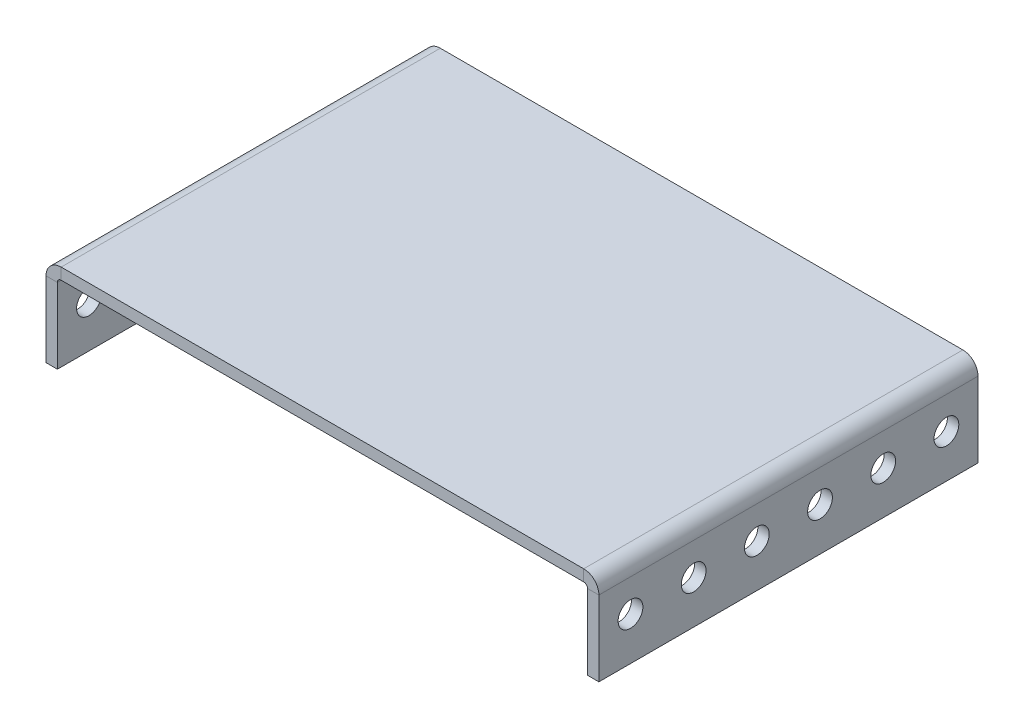
ISO-10303-21;
HEADER;
FILE_DESCRIPTION(('STEP AP214'),'2;1');
FILE_NAME('part.step','',(''),(''),'','','');
FILE_SCHEMA(('AUTOMOTIVE_DESIGN { 1 0 10303 214 1 1 1 1 }'));
ENDSEC;
DATA;
#1=APPLICATION_CONTEXT('core data for automotive mechanical design processes');
#2=APPLICATION_PROTOCOL_DEFINITION('international standard','automotive_design',2000,#1);
#3=PRODUCT_CONTEXT('',#1,'mechanical');
#4=PRODUCT('Part','Part','',(#3));
#5=PRODUCT_RELATED_PRODUCT_CATEGORY('part','',(#4));
#6=PRODUCT_DEFINITION_FORMATION('','',#4);
#7=PRODUCT_DEFINITION_CONTEXT('part definition',#1,'design');
#8=PRODUCT_DEFINITION('design','',#6,#7);
#9=PRODUCT_DEFINITION_SHAPE('','',#8);
#10=(LENGTH_UNIT() NAMED_UNIT(*) SI_UNIT(.MILLI.,.METRE.));
#11=(NAMED_UNIT(*) PLANE_ANGLE_UNIT() SI_UNIT($,.RADIAN.));
#12=(NAMED_UNIT(*) SI_UNIT($,.STERADIAN.) SOLID_ANGLE_UNIT());
#13=UNCERTAINTY_MEASURE_WITH_UNIT(LENGTH_MEASURE(1.E-05),#10,'distance_accuracy_value','');
#14=(GEOMETRIC_REPRESENTATION_CONTEXT(3) GLOBAL_UNCERTAINTY_ASSIGNED_CONTEXT((#13)) GLOBAL_UNIT_ASSIGNED_CONTEXT((#10,
#11,#12)) REPRESENTATION_CONTEXT('',''));
#15=CARTESIAN_POINT('',(0.,0.,0.));
#16=DIRECTION('',(0.,0.,1.));
#17=DIRECTION('',(1.,0.,0.));
#18=AXIS2_PLACEMENT_3D('',#15,#16,#17);
#19=CARTESIAN_POINT('',(52.5145,7.93749999999999,76.2));
#20=DIRECTION('',(0.,0.,1.));
#21=DIRECTION('',(1.,0.,0.));
#22=AXIS2_PLACEMENT_3D('',#19,#20,#21);
#23=PLANE('',#22);
#24=DIRECTION('',(0.,1.,0.));
#25=VECTOR('',#24,1.);
#26=CARTESIAN_POINT('',(52.5145,7.93749999999999,76.2));
#27=LINE('',#26,#25);
#28=CARTESIAN_POINT('',(52.5145,7.93749999999999,76.2));
#29=VERTEX_POINT('',#28);
#30=CARTESIAN_POINT('',(52.5145,10.2235,76.2));
#31=VERTEX_POINT('',#30);
#32=EDGE_CURVE('E11',#29,#31,#27,.T.);
#33=ORIENTED_EDGE('',*,*,#32,.F.);
#34=CARTESIAN_POINT('',(52.5145,7.17549999999999,76.2));
#35=DIRECTION('',(0.,0.,-1.));
#36=DIRECTION('',(-1.,0.,0.));
#37=AXIS2_PLACEMENT_3D('',#34,#35,#36);
#38=CIRCLE('',#37,0.762);
#39=CARTESIAN_POINT('',(53.2765,7.17549999999999,76.2));
#40=VERTEX_POINT('',#39);
#41=EDGE_CURVE('E252',#40,#29,#38,.F.);
#42=ORIENTED_EDGE('',*,*,#41,.F.);
#43=DIRECTION('',(-1.,0.,0.));
#44=VECTOR('',#43,1.);
#45=CARTESIAN_POINT('',(55.5625,7.17549999999999,76.2));
#46=LINE('',#45,#44);
#47=CARTESIAN_POINT('',(55.5625,7.17549999999999,76.2));
#48=VERTEX_POINT('',#47);
#49=EDGE_CURVE('E49',#48,#40,#46,.T.);
#50=ORIENTED_EDGE('',*,*,#49,.F.);
#51=CARTESIAN_POINT('',(52.5145,7.17549999999999,76.2));
#52=DIRECTION('',(0.,0.,1.));
#53=DIRECTION('',(1.,0.,0.));
#54=AXIS2_PLACEMENT_3D('',#51,#52,#53);
#55=CIRCLE('',#54,3.048);
#56=EDGE_CURVE('E150',#48,#31,#55,.T.);
#57=ORIENTED_EDGE('',*,*,#56,.T.);
#58=EDGE_LOOP('',(#33,#42,#50,#57));
#59=FACE_BOUND('',#58,.T.);
#60=ADVANCED_FACE('F41',(#59),#23,.T.);
#61=CARTESIAN_POINT('',(55.5625,7.17549999999999,76.2));
#62=DIRECTION('',(0.,0.,1.));
#63=DIRECTION('',(1.,0.,0.));
#64=AXIS2_PLACEMENT_3D('',#61,#62,#63);
#65=PLANE('',#64);
#66=DIRECTION('',(-1.,0.,0.));
#67=VECTOR('',#66,1.);
#68=CARTESIAN_POINT('',(-53.2765,7.9375,76.2));
#69=LINE('',#68,#67);
#70=CARTESIAN_POINT('',(-52.5145,7.9375,76.2));
#71=VERTEX_POINT('',#70);
#72=EDGE_CURVE('E144',#29,#71,#69,.T.);
#73=ORIENTED_EDGE('',*,*,#72,.F.);
#74=ORIENTED_EDGE('',*,*,#32,.T.);
#75=DIRECTION('',(-1.,0.,0.));
#76=VECTOR('',#75,1.);
#77=CARTESIAN_POINT('',(-53.2765,10.2235,76.2));
#78=LINE('',#77,#76);
#79=CARTESIAN_POINT('',(-52.5145,10.2235,76.2));
#80=VERTEX_POINT('',#79);
#81=EDGE_CURVE('E141',#31,#80,#78,.T.);
#82=ORIENTED_EDGE('',*,*,#81,.T.);
#83=DIRECTION('',(0.,-1.,0.));
#84=VECTOR('',#83,1.);
#85=CARTESIAN_POINT('',(-52.5145,10.2235,76.2));
#86=LINE('',#85,#84);
#87=EDGE_CURVE('E233',#80,#71,#86,.T.);
#88=ORIENTED_EDGE('',*,*,#87,.T.);
#89=EDGE_LOOP('',(#73,#74,#82,#88));
#90=FACE_BOUND('',#89,.T.);
#91=ADVANCED_FACE('F139',(#90),#65,.T.);
#92=CARTESIAN_POINT('',(53.2765,7.17549999999999,0.));
#93=DIRECTION('',(0.,0.,-1.));
#94=DIRECTION('',(-1.,0.,0.));
#95=AXIS2_PLACEMENT_3D('',#92,#93,#94);
#96=PLANE('',#95);
#97=DIRECTION('',(1.,0.,0.));
#98=VECTOR('',#97,1.);
#99=CARTESIAN_POINT('',(53.2765,7.17549999999999,0.));
#100=LINE('',#99,#98);
#101=CARTESIAN_POINT('',(53.2765,7.17549999999999,0.));
#102=VERTEX_POINT('',#101);
#103=CARTESIAN_POINT('',(55.5625,7.17549999999999,0.));
#104=VERTEX_POINT('',#103);
#105=EDGE_CURVE('E238',#102,#104,#100,.T.);
#106=ORIENTED_EDGE('',*,*,#105,.F.);
#107=CARTESIAN_POINT('',(52.5145,7.17549999999999,0.));
#108=DIRECTION('',(0.,0.,-1.));
#109=DIRECTION('',(-1.,0.,0.));
#110=AXIS2_PLACEMENT_3D('',#107,#108,#109);
#111=CIRCLE('',#110,0.762);
#112=CARTESIAN_POINT('',(52.5145,7.93749999999999,0.));
#113=VERTEX_POINT('',#112);
#114=EDGE_CURVE('E190',#102,#113,#111,.F.);
#115=ORIENTED_EDGE('',*,*,#114,.T.);
#116=DIRECTION('',(0.,-1.,0.));
#117=VECTOR('',#116,1.);
#118=CARTESIAN_POINT('',(52.5145,10.2235,0.));
#119=LINE('',#118,#117);
#120=CARTESIAN_POINT('',(52.5145,10.2235,0.));
#121=VERTEX_POINT('',#120);
#122=EDGE_CURVE('E236',#121,#113,#119,.T.);
#123=ORIENTED_EDGE('',*,*,#122,.F.);
#124=CARTESIAN_POINT('',(52.5145,7.17549999999999,0.));
#125=DIRECTION('',(0.,0.,1.));
#126=DIRECTION('',(1.,0.,0.));
#127=AXIS2_PLACEMENT_3D('',#124,#125,#126);
#128=CIRCLE('',#127,3.048);
#129=EDGE_CURVE('E162',#104,#121,#128,.T.);
#130=ORIENTED_EDGE('',*,*,#129,.F.);
#131=EDGE_LOOP('',(#106,#115,#123,#130));
#132=FACE_BOUND('',#131,.T.);
#133=ADVANCED_FACE('F365',(#132),#96,.T.);
#134=CARTESIAN_POINT('',(52.5145,10.2235,0.));
#135=DIRECTION('',(0.,0.,-1.));
#136=DIRECTION('',(-1.,0.,0.));
#137=AXIS2_PLACEMENT_3D('',#134,#135,#136);
#138=PLANE('',#137);
#139=DIRECTION('',(0.,1.,0.));
#140=VECTOR('',#139,1.);
#141=CARTESIAN_POINT('',(53.2765,7.93749999999999,0.));
#142=LINE('',#141,#140);
#143=CARTESIAN_POINT('',(53.2765,-7.93749999999999,0.));
#144=VERTEX_POINT('',#143);
#145=EDGE_CURVE('E193',#144,#102,#142,.T.);
#146=ORIENTED_EDGE('',*,*,#145,.T.);
#147=ORIENTED_EDGE('',*,*,#105,.T.);
#148=DIRECTION('',(0.,1.,0.));
#149=VECTOR('',#148,1.);
#150=CARTESIAN_POINT('',(55.5625,7.93749999999999,0.));
#151=LINE('',#150,#149);
#152=CARTESIAN_POINT('',(55.5625,-7.93749999999999,0.));
#153=VERTEX_POINT('',#152);
#154=EDGE_CURVE('E199',#153,#104,#151,.T.);
#155=ORIENTED_EDGE('',*,*,#154,.F.);
#156=DIRECTION('',(-1.,0.,0.));
#157=VECTOR('',#156,1.);
#158=CARTESIAN_POINT('',(55.5625,-7.93749999999999,0.));
#159=LINE('',#158,#157);
#160=EDGE_CURVE('E196',#153,#144,#159,.T.);
#161=ORIENTED_EDGE('',*,*,#160,.T.);
#162=EDGE_LOOP('',(#146,#147,#155,#161));
#163=FACE_BOUND('',#162,.T.);
#164=ADVANCED_FACE('F410',(#163),#138,.T.);
#165=CARTESIAN_POINT('',(-53.2765,7.1755,76.2));
#166=DIRECTION('',(0.,0.,1.));
#167=DIRECTION('',(1.,0.,0.));
#168=AXIS2_PLACEMENT_3D('',#165,#166,#167);
#169=PLANE('',#168);
#170=DIRECTION('',(-1.,0.,0.));
#171=VECTOR('',#170,1.);
#172=CARTESIAN_POINT('',(-53.2765,7.1755,76.2));
#173=LINE('',#172,#171);
#174=CARTESIAN_POINT('',(-53.2765,7.1755,76.2));
#175=VERTEX_POINT('',#174);
#176=CARTESIAN_POINT('',(-55.5625,7.1755,76.2));
#177=VERTEX_POINT('',#176);
#178=EDGE_CURVE('E57',#175,#177,#173,.T.);
#179=ORIENTED_EDGE('',*,*,#178,.F.);
#180=CARTESIAN_POINT('',(-52.5145,7.1755,76.2));
#181=DIRECTION('',(0.,0.,-1.));
#182=DIRECTION('',(-1.,0.,0.));
#183=AXIS2_PLACEMENT_3D('',#180,#181,#182);
#184=CIRCLE('',#183,0.762);
#185=EDGE_CURVE('E262',#71,#175,#184,.F.);
#186=ORIENTED_EDGE('',*,*,#185,.F.);
#187=ORIENTED_EDGE('',*,*,#87,.F.);
#188=CARTESIAN_POINT('',(-52.5145,7.1755,76.2));
#189=DIRECTION('',(0.,0.,1.));
#190=DIRECTION('',(1.,0.,0.));
#191=AXIS2_PLACEMENT_3D('',#188,#189,#190);
#192=CIRCLE('',#191,3.048);
#193=EDGE_CURVE('E170',#80,#177,#192,.T.);
#194=ORIENTED_EDGE('',*,*,#193,.T.);
#195=EDGE_LOOP('',(#179,#186,#187,#194));
#196=FACE_BOUND('',#195,.T.);
#197=ADVANCED_FACE('F415',(#196),#169,.T.);
#198=CARTESIAN_POINT('',(-52.5145,10.2235,76.2));
#199=DIRECTION('',(0.,0.,1.));
#200=DIRECTION('',(1.,0.,0.));
#201=AXIS2_PLACEMENT_3D('',#198,#199,#200);
#202=PLANE('',#201);
#203=DIRECTION('',(0.,-1.,0.));
#204=VECTOR('',#203,1.);
#205=CARTESIAN_POINT('',(-53.2765,7.9375,76.2));
#206=LINE('',#205,#204);
#207=CARTESIAN_POINT('',(-53.2765,-7.9375,76.2));
#208=VERTEX_POINT('',#207);
#209=EDGE_CURVE('E265',#175,#208,#206,.T.);
#210=ORIENTED_EDGE('',*,*,#209,.F.);
#211=ORIENTED_EDGE('',*,*,#178,.T.);
#212=DIRECTION('',(0.,1.,0.));
#213=VECTOR('',#212,1.);
#214=CARTESIAN_POINT('',(-55.5625,7.9375,76.2));
#215=LINE('',#214,#213);
#216=CARTESIAN_POINT('',(-55.5625,-7.9375,76.2));
#217=VERTEX_POINT('',#216);
#218=EDGE_CURVE('E111',#177,#217,#215,.F.);
#219=ORIENTED_EDGE('',*,*,#218,.T.);
#220=DIRECTION('',(-1.,0.,0.));
#221=VECTOR('',#220,1.);
#222=CARTESIAN_POINT('',(-53.2765,-7.9375,76.2));
#223=LINE('',#222,#221);
#224=EDGE_CURVE('E268',#208,#217,#223,.T.);
#225=ORIENTED_EDGE('',*,*,#224,.F.);
#226=EDGE_LOOP('',(#210,#211,#219,#225));
#227=FACE_BOUND('',#226,.T.);
#228=ADVANCED_FACE('F389',(#227),#202,.T.);
#229=CARTESIAN_POINT('',(-52.5145,7.9375,0.));
#230=DIRECTION('',(0.,0.,-1.));
#231=DIRECTION('',(-1.,0.,0.));
#232=AXIS2_PLACEMENT_3D('',#229,#230,#231);
#233=PLANE('',#232);
#234=DIRECTION('',(0.,1.,0.));
#235=VECTOR('',#234,1.);
#236=CARTESIAN_POINT('',(-52.5145,7.9375,0.));
#237=LINE('',#236,#235);
#238=CARTESIAN_POINT('',(-52.5145,7.9375,0.));
#239=VERTEX_POINT('',#238);
#240=CARTESIAN_POINT('',(-52.5145,10.2235,0.));
#241=VERTEX_POINT('',#240);
#242=EDGE_CURVE('E98',#239,#241,#237,.T.);
#243=ORIENTED_EDGE('',*,*,#242,.F.);
#244=CARTESIAN_POINT('',(-52.5145,7.1755,0.));
#245=DIRECTION('',(0.,0.,-1.));
#246=DIRECTION('',(-1.,0.,0.));
#247=AXIS2_PLACEMENT_3D('',#244,#245,#246);
#248=CIRCLE('',#247,0.762);
#249=CARTESIAN_POINT('',(-53.2765,7.1755,0.));
#250=VERTEX_POINT('',#249);
#251=EDGE_CURVE('E186',#239,#250,#248,.F.);
#252=ORIENTED_EDGE('',*,*,#251,.T.);
#253=DIRECTION('',(1.,0.,0.));
#254=VECTOR('',#253,1.);
#255=CARTESIAN_POINT('',(-55.5625,7.1755,0.));
#256=LINE('',#255,#254);
#257=CARTESIAN_POINT('',(-55.5625,7.1755,0.));
#258=VERTEX_POINT('',#257);
#259=EDGE_CURVE('E105',#258,#250,#256,.T.);
#260=ORIENTED_EDGE('',*,*,#259,.F.);
#261=CARTESIAN_POINT('',(-52.5145,7.1755,0.));
#262=DIRECTION('',(0.,0.,1.));
#263=DIRECTION('',(1.,0.,0.));
#264=AXIS2_PLACEMENT_3D('',#261,#262,#263);
#265=CIRCLE('',#264,3.048);
#266=EDGE_CURVE('E205',#241,#258,#265,.T.);
#267=ORIENTED_EDGE('',*,*,#266,.F.);
#268=EDGE_LOOP('',(#243,#252,#260,#267));
#269=FACE_BOUND('',#268,.T.);
#270=ADVANCED_FACE('F377',(#269),#233,.T.);
#271=CARTESIAN_POINT('',(-55.5625,7.1755,0.));
#272=DIRECTION('',(0.,0.,-1.));
#273=DIRECTION('',(-1.,0.,0.));
#274=AXIS2_PLACEMENT_3D('',#271,#272,#273);
#275=PLANE('',#274);
#276=DIRECTION('',(-1.,0.,0.));
#277=VECTOR('',#276,1.);
#278=CARTESIAN_POINT('',(-53.2765,7.9375,0.));
#279=LINE('',#278,#277);
#280=EDGE_CURVE('E188',#113,#239,#279,.T.);
#281=ORIENTED_EDGE('',*,*,#280,.T.);
#282=ORIENTED_EDGE('',*,*,#242,.T.);
#283=DIRECTION('',(-1.,0.,0.));
#284=VECTOR('',#283,1.);
#285=CARTESIAN_POINT('',(-53.2765,10.2235,0.));
#286=LINE('',#285,#284);
#287=EDGE_CURVE('E203',#121,#241,#286,.T.);
#288=ORIENTED_EDGE('',*,*,#287,.F.);
#289=ORIENTED_EDGE('',*,*,#122,.T.);
#290=EDGE_LOOP('',(#281,#282,#288,#289));
#291=FACE_BOUND('',#290,.T.);
#292=ADVANCED_FACE('F366',(#291),#275,.T.);
#293=CARTESIAN_POINT('',(-55.5625,7.9375,76.2));
#294=DIRECTION('',(1.,0.,0.));
#295=DIRECTION('',(0.,0.,-1.));
#296=AXIS2_PLACEMENT_3D('',#293,#294,#295);
#297=PLANE('',#296);
#298=CARTESIAN_POINT('',(-55.5625,0.698499999999999,6.35));
#299=DIRECTION('',(1.,0.,0.));
#300=DIRECTION('',(0.,0.,-1.));
#301=AXIS2_PLACEMENT_3D('',#298,#299,#300);
#302=CIRCLE('',#301,2.4892);
#303=CARTESIAN_POINT('',(-55.5625,0.698499999999999,3.8608));
#304=VERTEX_POINT('',#303);
#305=EDGE_CURVE('E307',#304,#304,#302,.T.);
#306=ORIENTED_EDGE('',*,*,#305,.T.);
#307=EDGE_LOOP('',(#306));
#308=FACE_BOUND('',#307,.T.);
#309=CARTESIAN_POINT('',(-55.5625,0.698499999999999,19.05));
#310=DIRECTION('',(1.,0.,0.));
#311=DIRECTION('',(0.,0.,-1.));
#312=AXIS2_PLACEMENT_3D('',#309,#310,#311);
#313=CIRCLE('',#312,2.4892);
#314=CARTESIAN_POINT('',(-55.5625,0.698499999999999,16.5608));
#315=VERTEX_POINT('',#314);
#316=EDGE_CURVE('E330',#315,#315,#313,.T.);
#317=ORIENTED_EDGE('',*,*,#316,.T.);
#318=EDGE_LOOP('',(#317));
#319=FACE_BOUND('',#318,.T.);
#320=CARTESIAN_POINT('',(-55.5625,0.698499999999999,31.75));
#321=DIRECTION('',(1.,0.,0.));
#322=DIRECTION('',(0.,0.,-1.));
#323=AXIS2_PLACEMENT_3D('',#320,#321,#322);
#324=CIRCLE('',#323,2.4892);
#325=CARTESIAN_POINT('',(-55.5625,0.698499999999999,29.2608));
#326=VERTEX_POINT('',#325);
#327=EDGE_CURVE('E324',#326,#326,#324,.T.);
#328=ORIENTED_EDGE('',*,*,#327,.T.);
#329=EDGE_LOOP('',(#328));
#330=FACE_BOUND('',#329,.T.);
#331=CARTESIAN_POINT('',(-55.5625,0.698499999999999,44.45));
#332=DIRECTION('',(1.,0.,0.));
#333=DIRECTION('',(0.,0.,-1.));
#334=AXIS2_PLACEMENT_3D('',#331,#332,#333);
#335=CIRCLE('',#334,2.4892);
#336=CARTESIAN_POINT('',(-55.5625,0.698499999999999,41.9608));
#337=VERTEX_POINT('',#336);
#338=EDGE_CURVE('E318',#337,#337,#335,.T.);
#339=ORIENTED_EDGE('',*,*,#338,.T.);
#340=EDGE_LOOP('',(#339));
#341=FACE_BOUND('',#340,.T.);
#342=CARTESIAN_POINT('',(-55.5625,0.698499999999999,57.15));
#343=DIRECTION('',(1.,0.,0.));
#344=DIRECTION('',(0.,0.,-1.));
#345=AXIS2_PLACEMENT_3D('',#342,#343,#344);
#346=CIRCLE('',#345,2.4892);
#347=CARTESIAN_POINT('',(-55.5625,0.698499999999999,54.6608));
#348=VERTEX_POINT('',#347);
#349=EDGE_CURVE('E311',#348,#348,#346,.T.);
#350=ORIENTED_EDGE('',*,*,#349,.T.);
#351=EDGE_LOOP('',(#350));
#352=FACE_BOUND('',#351,.T.);
#353=CARTESIAN_POINT('',(-55.5625,0.698499999999999,69.85));
#354=DIRECTION('',(1.,0.,0.));
#355=DIRECTION('',(0.,0.,-1.));
#356=AXIS2_PLACEMENT_3D('',#353,#354,#355);
#357=CIRCLE('',#356,2.48919999999999);
#358=CARTESIAN_POINT('',(-55.5625,0.698499999999999,67.3608));
#359=VERTEX_POINT('',#358);
#360=EDGE_CURVE('E312',#359,#359,#357,.T.);
#361=ORIENTED_EDGE('',*,*,#360,.T.);
#362=EDGE_LOOP('',(#361));
#363=FACE_BOUND('',#362,.T.);
#364=DIRECTION('',(0.,1.,0.));
#365=VECTOR('',#364,1.);
#366=CARTESIAN_POINT('',(-55.5625,7.9375,0.));
#367=LINE('',#366,#365);
#368=CARTESIAN_POINT('',(-55.5625,-7.9375,0.));
#369=VERTEX_POINT('',#368);
#370=EDGE_CURVE('E176',#258,#369,#367,.F.);
#371=ORIENTED_EDGE('',*,*,#370,.T.);
#372=DIRECTION('',(0.,0.,-1.));
#373=VECTOR('',#372,1.);
#374=CARTESIAN_POINT('',(-55.5625,-7.9375,76.2));
#375=LINE('',#374,#373);
#376=EDGE_CURVE('E229',#217,#369,#375,.T.);
#377=ORIENTED_EDGE('',*,*,#376,.F.);
#378=ORIENTED_EDGE('',*,*,#218,.F.);
#379=DIRECTION('',(0.,0.,-1.));
#380=VECTOR('',#379,1.);
#381=CARTESIAN_POINT('',(-55.5625,7.1755,76.2));
#382=LINE('',#381,#380);
#383=EDGE_CURVE('E172',#177,#258,#382,.T.);
#384=ORIENTED_EDGE('',*,*,#383,.T.);
#385=EDGE_LOOP('',(#371,#377,#378,#384));
#386=FACE_BOUND('',#385,.T.);
#387=ADVANCED_FACE('F383',(#308,#319,#330,#341,#352,#363,#386),#297,.F.);
#388=CARTESIAN_POINT('',(-53.2765,-7.9375,76.2));
#389=DIRECTION('',(0.,-1.,0.));
#390=DIRECTION('',(0.,0.,-1.));
#391=AXIS2_PLACEMENT_3D('',#388,#389,#390);
#392=PLANE('',#391);
#393=DIRECTION('',(-1.,0.,0.));
#394=VECTOR('',#393,1.);
#395=CARTESIAN_POINT('',(-53.2765,-7.9375,0.));
#396=LINE('',#395,#394);
#397=CARTESIAN_POINT('',(-53.2765,-7.9375,0.));
#398=VERTEX_POINT('',#397);
#399=EDGE_CURVE('E179',#398,#369,#396,.T.);
#400=ORIENTED_EDGE('',*,*,#399,.F.);
#401=DIRECTION('',(0.,0.,-1.));
#402=VECTOR('',#401,1.);
#403=CARTESIAN_POINT('',(-53.2765,-7.9375,76.2));
#404=LINE('',#403,#402);
#405=EDGE_CURVE('E227',#208,#398,#404,.T.);
#406=ORIENTED_EDGE('',*,*,#405,.F.);
#407=ORIENTED_EDGE('',*,*,#224,.T.);
#408=ORIENTED_EDGE('',*,*,#376,.T.);
#409=EDGE_LOOP('',(#400,#406,#407,#408));
#410=FACE_BOUND('',#409,.T.);
#411=ADVANCED_FACE('F388',(#410),#392,.T.);
#412=CARTESIAN_POINT('',(-53.2765,7.9375,76.2));
#413=DIRECTION('',(1.,0.,0.));
#414=DIRECTION('',(0.,0.,-1.));
#415=AXIS2_PLACEMENT_3D('',#412,#413,#414);
#416=PLANE('',#415);
#417=CARTESIAN_POINT('',(-53.2765,0.698499999999999,6.35));
#418=DIRECTION('',(1.,0.,0.));
#419=DIRECTION('',(0.,0.,-1.));
#420=AXIS2_PLACEMENT_3D('',#417,#418,#419);
#421=CIRCLE('',#420,2.4892);
#422=CARTESIAN_POINT('',(-53.2765,0.698499999999999,3.8608));
#423=VERTEX_POINT('',#422);
#424=EDGE_CURVE('E180',#423,#423,#421,.T.);
#425=ORIENTED_EDGE('',*,*,#424,.F.);
#426=EDGE_LOOP('',(#425));
#427=FACE_BOUND('',#426,.T.);
#428=CARTESIAN_POINT('',(-53.2765,0.698499999999999,19.05));
#429=DIRECTION('',(1.,0.,0.));
#430=DIRECTION('',(0.,0.,-1.));
#431=AXIS2_PLACEMENT_3D('',#428,#429,#430);
#432=CIRCLE('',#431,2.4892);
#433=CARTESIAN_POINT('',(-53.2765,0.698499999999999,16.5608));
#434=VERTEX_POINT('',#433);
#435=EDGE_CURVE('E277',#434,#434,#432,.T.);
#436=ORIENTED_EDGE('',*,*,#435,.F.);
#437=EDGE_LOOP('',(#436));
#438=FACE_BOUND('',#437,.T.);
#439=CARTESIAN_POINT('',(-53.2765,0.698499999999999,31.75));
#440=DIRECTION('',(1.,0.,0.));
#441=DIRECTION('',(0.,0.,-1.));
#442=AXIS2_PLACEMENT_3D('',#439,#440,#441);
#443=CIRCLE('',#442,2.4892);
#444=CARTESIAN_POINT('',(-53.2765,0.698499999999999,29.2608));
#445=VERTEX_POINT('',#444);
#446=EDGE_CURVE('E283',#445,#445,#443,.T.);
#447=ORIENTED_EDGE('',*,*,#446,.F.);
#448=EDGE_LOOP('',(#447));
#449=FACE_BOUND('',#448,.T.);
#450=CARTESIAN_POINT('',(-53.2765,0.698499999999999,44.45));
#451=DIRECTION('',(1.,0.,0.));
#452=DIRECTION('',(0.,0.,-1.));
#453=AXIS2_PLACEMENT_3D('',#450,#451,#452);
#454=CIRCLE('',#453,2.4892);
#455=CARTESIAN_POINT('',(-53.2765,0.698499999999999,41.9608));
#456=VERTEX_POINT('',#455);
#457=EDGE_CURVE('E289',#456,#456,#454,.T.);
#458=ORIENTED_EDGE('',*,*,#457,.F.);
#459=EDGE_LOOP('',(#458));
#460=FACE_BOUND('',#459,.T.);
#461=CARTESIAN_POINT('',(-53.2765,0.698499999999999,57.15));
#462=DIRECTION('',(1.,0.,0.));
#463=DIRECTION('',(0.,0.,-1.));
#464=AXIS2_PLACEMENT_3D('',#461,#462,#463);
#465=CIRCLE('',#464,2.4892);
#466=CARTESIAN_POINT('',(-53.2765,0.698499999999999,54.6608));
#467=VERTEX_POINT('',#466);
#468=EDGE_CURVE('E295',#467,#467,#465,.T.);
#469=ORIENTED_EDGE('',*,*,#468,.F.);
#470=EDGE_LOOP('',(#469));
#471=FACE_BOUND('',#470,.T.);
#472=CARTESIAN_POINT('',(-53.2765,0.698499999999999,69.85));
#473=DIRECTION('',(1.,0.,0.));
#474=DIRECTION('',(0.,0.,-1.));
#475=AXIS2_PLACEMENT_3D('',#472,#473,#474);
#476=CIRCLE('',#475,2.48919999999999);
#477=CARTESIAN_POINT('',(-53.2765,0.698499999999999,67.3608));
#478=VERTEX_POINT('',#477);
#479=EDGE_CURVE('E301',#478,#478,#476,.T.);
#480=ORIENTED_EDGE('',*,*,#479,.F.);
#481=EDGE_LOOP('',(#480));
#482=FACE_BOUND('',#481,.T.);
#483=DIRECTION('',(0.,-1.,0.));
#484=VECTOR('',#483,1.);
#485=CARTESIAN_POINT('',(-53.2765,7.9375,0.));
#486=LINE('',#485,#484);
#487=EDGE_CURVE('E183',#250,#398,#486,.T.);
#488=ORIENTED_EDGE('',*,*,#487,.F.);
#489=DIRECTION('',(0.,0.,-1.));
#490=VECTOR('',#489,1.);
#491=CARTESIAN_POINT('',(-53.2765,7.1755,76.2));
#492=LINE('',#491,#490);
#493=EDGE_CURVE('E224',#175,#250,#492,.T.);
#494=ORIENTED_EDGE('',*,*,#493,.F.);
#495=ORIENTED_EDGE('',*,*,#209,.T.);
#496=ORIENTED_EDGE('',*,*,#405,.T.);
#497=EDGE_LOOP('',(#488,#494,#495,#496));
#498=FACE_BOUND('',#497,.T.);
#499=ADVANCED_FACE('F391',(#427,#438,#449,#460,#471,#482,#498),#416,.T.);
#500=CARTESIAN_POINT('',(-52.5145,7.1755,76.2));
#501=DIRECTION('',(0.,0.,-1.));
#502=DIRECTION('',(-1.,0.,0.));
#503=AXIS2_PLACEMENT_3D('',#500,#501,#502);
#504=CYLINDRICAL_SURFACE('',#503,0.762);
#505=ORIENTED_EDGE('',*,*,#251,.F.);
#506=DIRECTION('',(0.,0.,-1.));
#507=VECTOR('',#506,1.);
#508=CARTESIAN_POINT('',(-52.5145,7.9375,76.2));
#509=LINE('',#508,#507);
#510=EDGE_CURVE('E221',#71,#239,#509,.T.);
#511=ORIENTED_EDGE('',*,*,#510,.F.);
#512=ORIENTED_EDGE('',*,*,#185,.T.);
#513=ORIENTED_EDGE('',*,*,#493,.T.);
#514=EDGE_LOOP('',(#505,#511,#512,#513));
#515=FACE_BOUND('',#514,.T.);
#516=ADVANCED_FACE('F374',(#515),#504,.F.);
#517=CARTESIAN_POINT('',(-53.2765,7.9375,76.2));
#518=DIRECTION('',(0.,-1.,0.));
#519=DIRECTION('',(1.,0.,0.));
#520=AXIS2_PLACEMENT_3D('',#517,#518,#519);
#521=PLANE('',#520);
#522=ORIENTED_EDGE('',*,*,#280,.F.);
#523=DIRECTION('',(0.,0.,-1.));
#524=VECTOR('',#523,1.);
#525=CARTESIAN_POINT('',(52.5145,7.93749999999999,76.2));
#526=LINE('',#525,#524);
#527=EDGE_CURVE('E218',#29,#113,#526,.T.);
#528=ORIENTED_EDGE('',*,*,#527,.F.);
#529=ORIENTED_EDGE('',*,*,#72,.T.);
#530=ORIENTED_EDGE('',*,*,#510,.T.);
#531=EDGE_LOOP('',(#522,#528,#529,#530));
#532=FACE_BOUND('',#531,.T.);
#533=ADVANCED_FACE('F369',(#532),#521,.T.);
#534=CARTESIAN_POINT('',(52.5145,7.17549999999999,76.2));
#535=DIRECTION('',(0.,0.,-1.));
#536=DIRECTION('',(-1.,0.,0.));
#537=AXIS2_PLACEMENT_3D('',#534,#535,#536);
#538=CYLINDRICAL_SURFACE('',#537,0.762);
#539=ORIENTED_EDGE('',*,*,#114,.F.);
#540=DIRECTION('',(0.,0.,-1.));
#541=VECTOR('',#540,1.);
#542=CARTESIAN_POINT('',(53.2765,7.17549999999999,76.2));
#543=LINE('',#542,#541);
#544=EDGE_CURVE('E215',#40,#102,#543,.T.);
#545=ORIENTED_EDGE('',*,*,#544,.F.);
#546=ORIENTED_EDGE('',*,*,#41,.T.);
#547=ORIENTED_EDGE('',*,*,#527,.T.);
#548=EDGE_LOOP('',(#539,#545,#546,#547));
#549=FACE_BOUND('',#548,.T.);
#550=ADVANCED_FACE('F251',(#549),#538,.F.);
#551=CARTESIAN_POINT('',(53.2765,7.93749999999999,76.2));
#552=DIRECTION('',(-1.,0.,0.));
#553=DIRECTION('',(0.,0.,1.));
#554=AXIS2_PLACEMENT_3D('',#551,#552,#553);
#555=PLANE('',#554);
#556=CARTESIAN_POINT('',(53.2765,0.698499999999999,6.35));
#557=DIRECTION('',(-1.,0.,0.));
#558=DIRECTION('',(0.,0.,1.));
#559=AXIS2_PLACEMENT_3D('',#556,#557,#558);
#560=CIRCLE('',#559,2.4892);
#561=CARTESIAN_POINT('',(53.2765,0.698499999999999,8.8392));
#562=VERTEX_POINT('',#561);
#563=EDGE_CURVE('E274',#562,#562,#560,.T.);
#564=ORIENTED_EDGE('',*,*,#563,.F.);
#565=EDGE_LOOP('',(#564));
#566=FACE_BOUND('',#565,.T.);
#567=CARTESIAN_POINT('',(53.2765,0.698499999999999,19.05));
#568=DIRECTION('',(-1.,0.,0.));
#569=DIRECTION('',(0.,0.,1.));
#570=AXIS2_PLACEMENT_3D('',#567,#568,#569);
#571=CIRCLE('',#570,2.4892);
#572=CARTESIAN_POINT('',(53.2765,0.698499999999999,21.5392));
#573=VERTEX_POINT('',#572);
#574=EDGE_CURVE('E280',#573,#573,#571,.T.);
#575=ORIENTED_EDGE('',*,*,#574,.F.);
#576=EDGE_LOOP('',(#575));
#577=FACE_BOUND('',#576,.T.);
#578=CARTESIAN_POINT('',(53.2765,0.698499999999999,31.75));
#579=DIRECTION('',(-1.,0.,0.));
#580=DIRECTION('',(0.,0.,1.));
#581=AXIS2_PLACEMENT_3D('',#578,#579,#580);
#582=CIRCLE('',#581,2.4892);
#583=CARTESIAN_POINT('',(53.2765,0.698499999999999,34.2392));
#584=VERTEX_POINT('',#583);
#585=EDGE_CURVE('E286',#584,#584,#582,.T.);
#586=ORIENTED_EDGE('',*,*,#585,.F.);
#587=EDGE_LOOP('',(#586));
#588=FACE_BOUND('',#587,.T.);
#589=CARTESIAN_POINT('',(53.2765,0.698499999999999,44.45));
#590=DIRECTION('',(-1.,0.,0.));
#591=DIRECTION('',(0.,0.,1.));
#592=AXIS2_PLACEMENT_3D('',#589,#590,#591);
#593=CIRCLE('',#592,2.4892);
#594=CARTESIAN_POINT('',(53.2765,0.698499999999999,46.9392));
#595=VERTEX_POINT('',#594);
#596=EDGE_CURVE('E292',#595,#595,#593,.T.);
#597=ORIENTED_EDGE('',*,*,#596,.F.);
#598=EDGE_LOOP('',(#597));
#599=FACE_BOUND('',#598,.T.);
#600=CARTESIAN_POINT('',(53.2765,0.698499999999999,57.15));
#601=DIRECTION('',(-1.,0.,0.));
#602=DIRECTION('',(0.,0.,1.));
#603=AXIS2_PLACEMENT_3D('',#600,#601,#602);
#604=CIRCLE('',#603,2.4892);
#605=CARTESIAN_POINT('',(53.2765,0.698499999999999,59.6392));
#606=VERTEX_POINT('',#605);
#607=EDGE_CURVE('E298',#606,#606,#604,.T.);
#608=ORIENTED_EDGE('',*,*,#607,.F.);
#609=EDGE_LOOP('',(#608));
#610=FACE_BOUND('',#609,.T.);
#611=CARTESIAN_POINT('',(53.2765,0.698499999999999,69.85));
#612=DIRECTION('',(-1.,0.,0.));
#613=DIRECTION('',(0.,0.,1.));
#614=AXIS2_PLACEMENT_3D('',#611,#612,#613);
#615=CIRCLE('',#614,2.48919999999999);
#616=CARTESIAN_POINT('',(53.2765,0.698499999999999,72.3392));
#617=VERTEX_POINT('',#616);
#618=EDGE_CURVE('E304',#617,#617,#615,.T.);
#619=ORIENTED_EDGE('',*,*,#618,.F.);
#620=EDGE_LOOP('',(#619));
#621=FACE_BOUND('',#620,.T.);
#622=ORIENTED_EDGE('',*,*,#145,.F.);
#623=DIRECTION('',(0.,0.,-1.));
#624=VECTOR('',#623,1.);
#625=CARTESIAN_POINT('',(53.2765,-7.93749999999999,76.2));
#626=LINE('',#625,#624);
#627=CARTESIAN_POINT('',(53.2765,-7.93749999999999,76.2));
#628=VERTEX_POINT('',#627);
#629=EDGE_CURVE('E213',#628,#144,#626,.T.);
#630=ORIENTED_EDGE('',*,*,#629,.F.);
#631=DIRECTION('',(0.,1.,0.));
#632=VECTOR('',#631,1.);
#633=CARTESIAN_POINT('',(53.2765,7.93749999999999,76.2));
#634=LINE('',#633,#632);
#635=EDGE_CURVE('E245',#628,#40,#634,.T.);
#636=ORIENTED_EDGE('',*,*,#635,.T.);
#637=ORIENTED_EDGE('',*,*,#544,.T.);
#638=EDGE_LOOP('',(#622,#630,#636,#637));
#639=FACE_BOUND('',#638,.T.);
#640=ADVANCED_FACE('F256',(#566,#577,#588,#599,#610,#621,#639),#555,.T.);
#641=CARTESIAN_POINT('',(55.5625,-7.93749999999999,76.2));
#642=DIRECTION('',(0.,-1.,0.));
#643=DIRECTION('',(0.,0.,-1.));
#644=AXIS2_PLACEMENT_3D('',#641,#642,#643);
#645=PLANE('',#644);
#646=ORIENTED_EDGE('',*,*,#160,.F.);
#647=DIRECTION('',(0.,0.,-1.));
#648=VECTOR('',#647,1.);
#649=CARTESIAN_POINT('',(55.5625,-7.93749999999999,76.2));
#650=LINE('',#649,#648);
#651=CARTESIAN_POINT('',(55.5625,-7.93749999999999,76.2));
#652=VERTEX_POINT('',#651);
#653=EDGE_CURVE('E211',#652,#153,#650,.T.);
#654=ORIENTED_EDGE('',*,*,#653,.F.);
#655=DIRECTION('',(-1.,0.,0.));
#656=VECTOR('',#655,1.);
#657=CARTESIAN_POINT('',(55.5625,-7.93749999999999,76.2));
#658=LINE('',#657,#656);
#659=EDGE_CURVE('E257',#652,#628,#658,.T.);
#660=ORIENTED_EDGE('',*,*,#659,.T.);
#661=ORIENTED_EDGE('',*,*,#629,.T.);
#662=EDGE_LOOP('',(#646,#654,#660,#661));
#663=FACE_BOUND('',#662,.T.);
#664=ADVANCED_FACE('F349',(#663),#645,.T.);
#665=CARTESIAN_POINT('',(55.5625,7.93749999999999,76.2));
#666=DIRECTION('',(-1.,0.,0.));
#667=DIRECTION('',(0.,0.,1.));
#668=AXIS2_PLACEMENT_3D('',#665,#666,#667);
#669=PLANE('',#668);
#670=CARTESIAN_POINT('',(55.5625,0.698499999999999,6.35));
#671=DIRECTION('',(1.,0.,0.));
#672=DIRECTION('',(0.,0.,-1.));
#673=AXIS2_PLACEMENT_3D('',#670,#671,#672);
#674=CIRCLE('',#673,2.4892);
#675=CARTESIAN_POINT('',(55.5625,0.698499999999999,3.8608));
#676=VERTEX_POINT('',#675);
#677=EDGE_CURVE('E336',#676,#676,#674,.T.);
#678=ORIENTED_EDGE('',*,*,#677,.F.);
#679=EDGE_LOOP('',(#678));
#680=FACE_BOUND('',#679,.T.);
#681=CARTESIAN_POINT('',(55.5625,0.698499999999999,19.05));
#682=DIRECTION('',(1.,0.,0.));
#683=DIRECTION('',(0.,0.,-1.));
#684=AXIS2_PLACEMENT_3D('',#681,#682,#683);
#685=CIRCLE('',#684,2.4892);
#686=CARTESIAN_POINT('',(55.5625,0.698499999999999,16.5608));
#687=VERTEX_POINT('',#686);
#688=EDGE_CURVE('E333',#687,#687,#685,.T.);
#689=ORIENTED_EDGE('',*,*,#688,.F.);
#690=EDGE_LOOP('',(#689));
#691=FACE_BOUND('',#690,.T.);
#692=CARTESIAN_POINT('',(55.5625,0.698499999999999,31.75));
#693=DIRECTION('',(1.,0.,0.));
#694=DIRECTION('',(0.,0.,-1.));
#695=AXIS2_PLACEMENT_3D('',#692,#693,#694);
#696=CIRCLE('',#695,2.4892);
#697=CARTESIAN_POINT('',(55.5625,0.698499999999999,29.2608));
#698=VERTEX_POINT('',#697);
#699=EDGE_CURVE('E327',#698,#698,#696,.T.);
#700=ORIENTED_EDGE('',*,*,#699,.F.);
#701=EDGE_LOOP('',(#700));
#702=FACE_BOUND('',#701,.T.);
#703=CARTESIAN_POINT('',(55.5625,0.698499999999999,44.45));
#704=DIRECTION('',(1.,0.,0.));
#705=DIRECTION('',(0.,0.,-1.));
#706=AXIS2_PLACEMENT_3D('',#703,#704,#705);
#707=CIRCLE('',#706,2.4892);
#708=CARTESIAN_POINT('',(55.5625,0.698499999999999,41.9608));
#709=VERTEX_POINT('',#708);
#710=EDGE_CURVE('E321',#709,#709,#707,.T.);
#711=ORIENTED_EDGE('',*,*,#710,.F.);
#712=EDGE_LOOP('',(#711));
#713=FACE_BOUND('',#712,.T.);
#714=CARTESIAN_POINT('',(55.5625,0.698499999999999,57.15));
#715=DIRECTION('',(1.,0.,0.));
#716=DIRECTION('',(0.,0.,-1.));
#717=AXIS2_PLACEMENT_3D('',#714,#715,#716);
#718=CIRCLE('',#717,2.4892);
#719=CARTESIAN_POINT('',(55.5625,0.698499999999999,54.6608));
#720=VERTEX_POINT('',#719);
#721=EDGE_CURVE('E315',#720,#720,#718,.T.);
#722=ORIENTED_EDGE('',*,*,#721,.F.);
#723=EDGE_LOOP('',(#722));
#724=FACE_BOUND('',#723,.T.);
#725=CARTESIAN_POINT('',(55.5625,0.698499999999999,69.85));
#726=DIRECTION('',(1.,0.,0.));
#727=DIRECTION('',(0.,0.,-1.));
#728=AXIS2_PLACEMENT_3D('',#725,#726,#727);
#729=CIRCLE('',#728,2.48919999999999);
#730=CARTESIAN_POINT('',(55.5625,0.698499999999999,67.3608));
#731=VERTEX_POINT('',#730);
#732=EDGE_CURVE('E308',#731,#731,#729,.T.);
#733=ORIENTED_EDGE('',*,*,#732,.F.);
#734=EDGE_LOOP('',(#733));
#735=FACE_BOUND('',#734,.T.);
#736=ORIENTED_EDGE('',*,*,#154,.T.);
#737=DIRECTION('',(0.,0.,-1.));
#738=VECTOR('',#737,1.);
#739=CARTESIAN_POINT('',(55.5625,7.17549999999999,76.2));
#740=LINE('',#739,#738);
#741=EDGE_CURVE('E164',#48,#104,#740,.T.);
#742=ORIENTED_EDGE('',*,*,#741,.F.);
#743=DIRECTION('',(0.,1.,0.));
#744=VECTOR('',#743,1.);
#745=CARTESIAN_POINT('',(55.5625,7.93749999999999,76.2));
#746=LINE('',#745,#744);
#747=EDGE_CURVE('E155',#652,#48,#746,.T.);
#748=ORIENTED_EDGE('',*,*,#747,.F.);
#749=ORIENTED_EDGE('',*,*,#653,.T.);
#750=EDGE_LOOP('',(#736,#742,#748,#749));
#751=FACE_BOUND('',#750,.T.);
#752=ADVANCED_FACE('F346',(#680,#691,#702,#713,#724,#735,#751),#669,.F.);
#753=CARTESIAN_POINT('',(52.5145,7.17549999999999,76.2));
#754=DIRECTION('',(0.,0.,-1.));
#755=DIRECTION('',(-1.,0.,0.));
#756=AXIS2_PLACEMENT_3D('',#753,#754,#755);
#757=CYLINDRICAL_SURFACE('',#756,3.048);
#758=ORIENTED_EDGE('',*,*,#129,.T.);
#759=DIRECTION('',(0.,0.,-1.));
#760=VECTOR('',#759,1.);
#761=CARTESIAN_POINT('',(52.5145,10.2235,76.2));
#762=LINE('',#761,#760);
#763=EDGE_CURVE('E159',#31,#121,#762,.T.);
#764=ORIENTED_EDGE('',*,*,#763,.F.);
#765=ORIENTED_EDGE('',*,*,#56,.F.);
#766=ORIENTED_EDGE('',*,*,#741,.T.);
#767=EDGE_LOOP('',(#758,#764,#765,#766));
#768=FACE_BOUND('',#767,.T.);
#769=ADVANCED_FACE('F160',(#768),#757,.T.);
#770=CARTESIAN_POINT('',(-53.2765,10.2235,76.2));
#771=DIRECTION('',(0.,-1.,0.));
#772=DIRECTION('',(1.,0.,0.));
#773=AXIS2_PLACEMENT_3D('',#770,#771,#772);
#774=PLANE('',#773);
#775=ORIENTED_EDGE('',*,*,#287,.T.);
#776=DIRECTION('',(0.,0.,-1.));
#777=VECTOR('',#776,1.);
#778=CARTESIAN_POINT('',(-52.5145,10.2235,76.2));
#779=LINE('',#778,#777);
#780=EDGE_CURVE('E165',#80,#241,#779,.T.);
#781=ORIENTED_EDGE('',*,*,#780,.F.);
#782=ORIENTED_EDGE('',*,*,#81,.F.);
#783=ORIENTED_EDGE('',*,*,#763,.T.);
#784=EDGE_LOOP('',(#775,#781,#782,#783));
#785=FACE_BOUND('',#784,.T.);
#786=ADVANCED_FACE('F167',(#785),#774,.F.);
#787=CARTESIAN_POINT('',(-52.5145,7.1755,76.2));
#788=DIRECTION('',(0.,0.,-1.));
#789=DIRECTION('',(-1.,0.,0.));
#790=AXIS2_PLACEMENT_3D('',#787,#788,#789);
#791=CYLINDRICAL_SURFACE('',#790,3.048);
#792=ORIENTED_EDGE('',*,*,#266,.T.);
#793=ORIENTED_EDGE('',*,*,#383,.F.);
#794=ORIENTED_EDGE('',*,*,#193,.F.);
#795=ORIENTED_EDGE('',*,*,#780,.T.);
#796=EDGE_LOOP('',(#792,#793,#794,#795));
#797=FACE_BOUND('',#796,.T.);
#798=ADVANCED_FACE('F380',(#797),#791,.T.);
#799=CARTESIAN_POINT('',(-52.5145,7.1755,76.2));
#800=DIRECTION('',(0.,0.,-1.));
#801=DIRECTION('',(-1.,0.,0.));
#802=AXIS2_PLACEMENT_3D('',#799,#800,#801);
#803=PLANE('',#802);
#804=ORIENTED_EDGE('',*,*,#747,.T.);
#805=ORIENTED_EDGE('',*,*,#49,.T.);
#806=ORIENTED_EDGE('',*,*,#635,.F.);
#807=ORIENTED_EDGE('',*,*,#659,.F.);
#808=EDGE_LOOP('',(#804,#805,#806,#807));
#809=FACE_BOUND('',#808,.T.);
#810=ADVANCED_FACE('F242',(#809),#803,.F.);
#811=CARTESIAN_POINT('',(-52.5145,7.1755,0.));
#812=DIRECTION('',(0.,0.,-1.));
#813=DIRECTION('',(-1.,0.,0.));
#814=AXIS2_PLACEMENT_3D('',#811,#812,#813);
#815=PLANE('',#814);
#816=ORIENTED_EDGE('',*,*,#370,.F.);
#817=ORIENTED_EDGE('',*,*,#259,.T.);
#818=ORIENTED_EDGE('',*,*,#487,.T.);
#819=ORIENTED_EDGE('',*,*,#399,.T.);
#820=EDGE_LOOP('',(#816,#817,#818,#819));
#821=FACE_BOUND('',#820,.T.);
#822=ADVANCED_FACE('F385',(#821),#815,.T.);
#823=CARTESIAN_POINT('',(-55.5625,0.698499999999999,69.85));
#824=DIRECTION('',(1.,0.,0.));
#825=DIRECTION('',(0.,0.,-1.));
#826=AXIS2_PLACEMENT_3D('',#823,#824,#825);
#827=CYLINDRICAL_SURFACE('',#826,2.48919999999999);
#828=ORIENTED_EDGE('',*,*,#618,.T.);
#829=EDGE_LOOP('',(#828));
#830=FACE_BOUND('',#829,.T.);
#831=ORIENTED_EDGE('',*,*,#732,.T.);
#832=EDGE_LOOP('',(#831));
#833=FACE_BOUND('',#832,.T.);
#834=ADVANCED_FACE('F446',(#830,#833),#827,.F.);
#835=CARTESIAN_POINT('',(-55.5625,0.698499999999999,57.15));
#836=DIRECTION('',(1.,0.,0.));
#837=DIRECTION('',(0.,0.,-1.));
#838=AXIS2_PLACEMENT_3D('',#835,#836,#837);
#839=CYLINDRICAL_SURFACE('',#838,2.4892);
#840=ORIENTED_EDGE('',*,*,#607,.T.);
#841=EDGE_LOOP('',(#840));
#842=FACE_BOUND('',#841,.T.);
#843=ORIENTED_EDGE('',*,*,#721,.T.);
#844=EDGE_LOOP('',(#843));
#845=FACE_BOUND('',#844,.T.);
#846=ADVANCED_FACE('F454',(#842,#845),#839,.F.);
#847=CARTESIAN_POINT('',(-55.5625,0.698499999999999,44.45));
#848=DIRECTION('',(1.,0.,0.));
#849=DIRECTION('',(0.,0.,-1.));
#850=AXIS2_PLACEMENT_3D('',#847,#848,#849);
#851=CYLINDRICAL_SURFACE('',#850,2.4892);
#852=ORIENTED_EDGE('',*,*,#596,.T.);
#853=EDGE_LOOP('',(#852));
#854=FACE_BOUND('',#853,.T.);
#855=ORIENTED_EDGE('',*,*,#710,.T.);
#856=EDGE_LOOP('',(#855));
#857=FACE_BOUND('',#856,.T.);
#858=ADVANCED_FACE('F466',(#854,#857),#851,.F.);
#859=CARTESIAN_POINT('',(-55.5625,0.698499999999999,31.75));
#860=DIRECTION('',(1.,0.,0.));
#861=DIRECTION('',(0.,0.,-1.));
#862=AXIS2_PLACEMENT_3D('',#859,#860,#861);
#863=CYLINDRICAL_SURFACE('',#862,2.4892);
#864=ORIENTED_EDGE('',*,*,#585,.T.);
#865=EDGE_LOOP('',(#864));
#866=FACE_BOUND('',#865,.T.);
#867=ORIENTED_EDGE('',*,*,#699,.T.);
#868=EDGE_LOOP('',(#867));
#869=FACE_BOUND('',#868,.T.);
#870=ADVANCED_FACE('F590',(#866,#869),#863,.F.);
#871=CARTESIAN_POINT('',(-55.5625,0.698499999999999,19.05));
#872=DIRECTION('',(1.,0.,0.));
#873=DIRECTION('',(0.,0.,-1.));
#874=AXIS2_PLACEMENT_3D('',#871,#872,#873);
#875=CYLINDRICAL_SURFACE('',#874,2.4892);
#876=ORIENTED_EDGE('',*,*,#574,.T.);
#877=EDGE_LOOP('',(#876));
#878=FACE_BOUND('',#877,.T.);
#879=ORIENTED_EDGE('',*,*,#688,.T.);
#880=EDGE_LOOP('',(#879));
#881=FACE_BOUND('',#880,.T.);
#882=ADVANCED_FACE('F455',(#878,#881),#875,.F.);
#883=CARTESIAN_POINT('',(-55.5625,0.698499999999999,6.35));
#884=DIRECTION('',(1.,0.,0.));
#885=DIRECTION('',(0.,0.,-1.));
#886=AXIS2_PLACEMENT_3D('',#883,#884,#885);
#887=CYLINDRICAL_SURFACE('',#886,2.4892);
#888=ORIENTED_EDGE('',*,*,#563,.T.);
#889=EDGE_LOOP('',(#888));
#890=FACE_BOUND('',#889,.T.);
#891=ORIENTED_EDGE('',*,*,#677,.T.);
#892=EDGE_LOOP('',(#891));
#893=FACE_BOUND('',#892,.T.);
#894=ADVANCED_FACE('F344',(#890,#893),#887,.F.);
#895=ORIENTED_EDGE('',*,*,#479,.T.);
#896=EDGE_LOOP('',(#895));
#897=FACE_BOUND('',#896,.T.);
#898=ORIENTED_EDGE('',*,*,#360,.F.);
#899=EDGE_LOOP('',(#898));
#900=FACE_BOUND('',#899,.T.);
#901=ADVANCED_FACE('F441',(#897,#900),#827,.F.);
#902=ORIENTED_EDGE('',*,*,#468,.T.);
#903=EDGE_LOOP('',(#902));
#904=FACE_BOUND('',#903,.T.);
#905=ORIENTED_EDGE('',*,*,#349,.F.);
#906=EDGE_LOOP('',(#905));
#907=FACE_BOUND('',#906,.T.);
#908=ADVANCED_FACE('F443',(#904,#907),#839,.F.);
#909=ORIENTED_EDGE('',*,*,#457,.T.);
#910=EDGE_LOOP('',(#909));
#911=FACE_BOUND('',#910,.T.);
#912=ORIENTED_EDGE('',*,*,#338,.F.);
#913=EDGE_LOOP('',(#912));
#914=FACE_BOUND('',#913,.T.);
#915=ADVANCED_FACE('F451',(#911,#914),#851,.F.);
#916=ORIENTED_EDGE('',*,*,#446,.T.);
#917=EDGE_LOOP('',(#916));
#918=FACE_BOUND('',#917,.T.);
#919=ORIENTED_EDGE('',*,*,#327,.F.);
#920=EDGE_LOOP('',(#919));
#921=FACE_BOUND('',#920,.T.);
#922=ADVANCED_FACE('F603',(#918,#921),#863,.F.);
#923=ORIENTED_EDGE('',*,*,#435,.T.);
#924=EDGE_LOOP('',(#923));
#925=FACE_BOUND('',#924,.T.);
#926=ORIENTED_EDGE('',*,*,#316,.F.);
#927=EDGE_LOOP('',(#926));
#928=FACE_BOUND('',#927,.T.);
#929=ADVANCED_FACE('F614',(#925,#928),#875,.F.);
#930=ORIENTED_EDGE('',*,*,#424,.T.);
#931=EDGE_LOOP('',(#930));
#932=FACE_BOUND('',#931,.T.);
#933=ORIENTED_EDGE('',*,*,#305,.F.);
#934=EDGE_LOOP('',(#933));
#935=FACE_BOUND('',#934,.T.);
#936=ADVANCED_FACE('F458',(#932,#935),#887,.F.);
#937=CLOSED_SHELL('',(#60,#91,#133,#164,#197,#228,#270,#292,#387,#411,#499,#516,#533,#550,#640,
#664,#752,#769,#786,#798,#810,#822,#834,#846,#858,#870,#882,#894,#901,#908,#915,#922,#929,#936));
#938=MANIFOLD_SOLID_BREP('B2',#937);
#939=ADVANCED_BREP_SHAPE_REPRESENTATION('',(#18,#938),#14);
#940=SHAPE_DEFINITION_REPRESENTATION(#9,#939);
ENDSEC;
END-ISO-10303-21;
